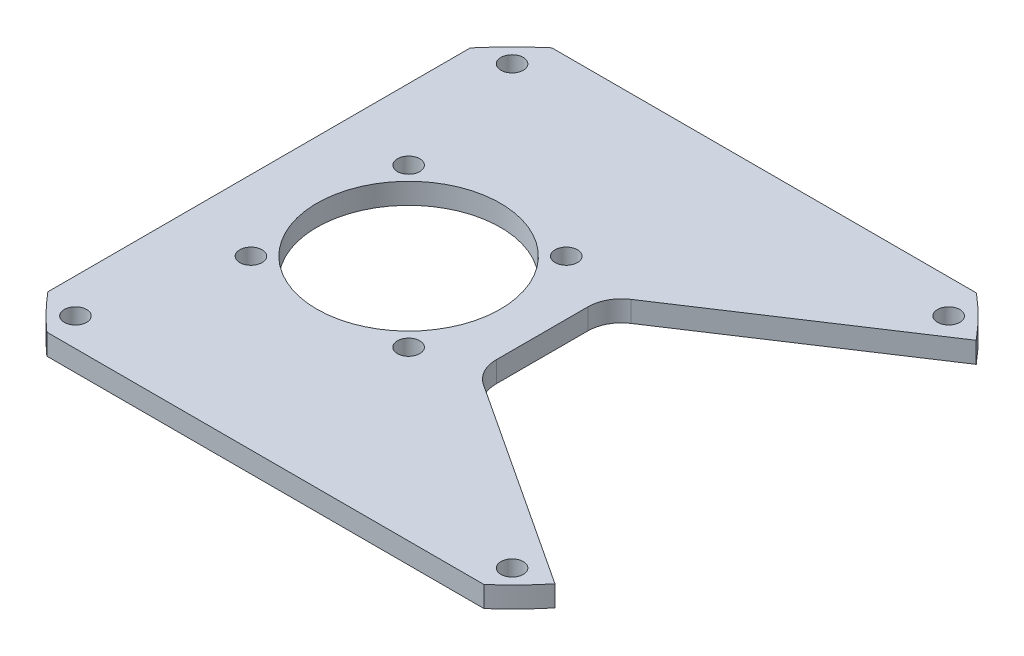
ISO-10303-21;
HEADER;
FILE_DESCRIPTION(('STEP AP214'),'2;1');
FILE_NAME('part.step','',(''),(''),'','','');
FILE_SCHEMA(('AUTOMOTIVE_DESIGN { 1 0 10303 214 1 1 1 1 }'));
ENDSEC;
DATA;
#1=APPLICATION_CONTEXT('core data for automotive mechanical design processes');
#2=APPLICATION_PROTOCOL_DEFINITION('international standard','automotive_design',2000,#1);
#3=PRODUCT_CONTEXT('',#1,'mechanical');
#4=PRODUCT('Part','Part','',(#3));
#5=PRODUCT_RELATED_PRODUCT_CATEGORY('part','',(#4));
#6=PRODUCT_DEFINITION_FORMATION('','',#4);
#7=PRODUCT_DEFINITION_CONTEXT('part definition',#1,'design');
#8=PRODUCT_DEFINITION('design','',#6,#7);
#9=PRODUCT_DEFINITION_SHAPE('','',#8);
#10=(LENGTH_UNIT() NAMED_UNIT(*) SI_UNIT(.MILLI.,.METRE.));
#11=(NAMED_UNIT(*) PLANE_ANGLE_UNIT() SI_UNIT($,.RADIAN.));
#12=(NAMED_UNIT(*) SI_UNIT($,.STERADIAN.) SOLID_ANGLE_UNIT());
#13=UNCERTAINTY_MEASURE_WITH_UNIT(LENGTH_MEASURE(1.E-05),#10,'distance_accuracy_value','');
#14=(GEOMETRIC_REPRESENTATION_CONTEXT(3) GLOBAL_UNCERTAINTY_ASSIGNED_CONTEXT((#13)) GLOBAL_UNIT_ASSIGNED_CONTEXT((#10,
#11,#12)) REPRESENTATION_CONTEXT('',''));
#15=CARTESIAN_POINT('',(0.,0.,0.));
#16=DIRECTION('',(0.,0.,1.));
#17=DIRECTION('',(1.,0.,0.));
#18=AXIS2_PLACEMENT_3D('',#15,#16,#17);
#19=CARTESIAN_POINT('',(0.,1.5875,0.));
#20=DIRECTION('',(0.,1.,0.));
#21=DIRECTION('',(0.,0.,1.));
#22=AXIS2_PLACEMENT_3D('',#19,#20,#21);
#23=PLANE('',#22);
#24=CARTESIAN_POINT('',(-27.748,1.5875,-12.));
#25=DIRECTION('',(0.,1.,0.));
#26=DIRECTION('',(0.,0.,1.));
#27=AXIS2_PLACEMENT_3D('',#24,#25,#26);
#28=CIRCLE('',#27,1.69999999999999);
#29=CARTESIAN_POINT('',(-27.748,1.5875,-10.3));
#30=VERTEX_POINT('',#29);
#31=EDGE_CURVE('E296',#30,#30,#28,.T.);
#32=ORIENTED_EDGE('',*,*,#31,.F.);
#33=EDGE_LOOP('',(#32));
#34=FACE_BOUND('',#33,.T.);
#35=CARTESIAN_POINT('',(-3.748,1.5875,-12.));
#36=DIRECTION('',(0.,1.,0.));
#37=DIRECTION('',(0.,0.,1.));
#38=AXIS2_PLACEMENT_3D('',#35,#36,#37);
#39=CIRCLE('',#38,1.69999999999999);
#40=CARTESIAN_POINT('',(-3.748,1.5875,-10.3));
#41=VERTEX_POINT('',#40);
#42=EDGE_CURVE('E290',#41,#41,#39,.T.);
#43=ORIENTED_EDGE('',*,*,#42,.F.);
#44=EDGE_LOOP('',(#43));
#45=FACE_BOUND('',#44,.T.);
#46=CARTESIAN_POINT('',(-3.74799999999999,1.5875,12.));
#47=DIRECTION('',(0.,1.,0.));
#48=DIRECTION('',(0.,0.,1.));
#49=AXIS2_PLACEMENT_3D('',#46,#47,#48);
#50=CIRCLE('',#49,1.69999999999999);
#51=CARTESIAN_POINT('',(-3.74799999999999,1.5875,13.7));
#52=VERTEX_POINT('',#51);
#53=EDGE_CURVE('E284',#52,#52,#50,.T.);
#54=ORIENTED_EDGE('',*,*,#53,.F.);
#55=EDGE_LOOP('',(#54));
#56=FACE_BOUND('',#55,.T.);
#57=CARTESIAN_POINT('',(-27.748,1.5875,12.));
#58=DIRECTION('',(0.,1.,0.));
#59=DIRECTION('',(0.,0.,1.));
#60=AXIS2_PLACEMENT_3D('',#57,#58,#59);
#61=CIRCLE('',#60,1.69999999999999);
#62=CARTESIAN_POINT('',(-27.748,1.5875,13.7));
#63=VERTEX_POINT('',#62);
#64=EDGE_CURVE('E278',#63,#63,#61,.T.);
#65=ORIENTED_EDGE('',*,*,#64,.F.);
#66=EDGE_LOOP('',(#65));
#67=FACE_BOUND('',#66,.T.);
#68=CARTESIAN_POINT('',(-33.2269476479559,1.5875,-33.2269476479559));
#69=DIRECTION('',(0.,1.,0.));
#70=DIRECTION('',(0.,0.,1.));
#71=AXIS2_PLACEMENT_3D('',#68,#69,#70);
#72=CIRCLE('',#71,1.7);
#73=CARTESIAN_POINT('',(-33.2269476479559,1.5875,-31.5269476479559));
#74=VERTEX_POINT('',#73);
#75=EDGE_CURVE('E272',#74,#74,#72,.T.);
#76=ORIENTED_EDGE('',*,*,#75,.F.);
#77=EDGE_LOOP('',(#76));
#78=FACE_BOUND('',#77,.T.);
#79=CARTESIAN_POINT('',(33.2269476479559,1.5875,-33.2269476479559));
#80=DIRECTION('',(0.,1.,0.));
#81=DIRECTION('',(0.,0.,1.));
#82=AXIS2_PLACEMENT_3D('',#79,#80,#81);
#83=CIRCLE('',#82,1.7);
#84=CARTESIAN_POINT('',(33.2269476479559,1.5875,-31.5269476479559));
#85=VERTEX_POINT('',#84);
#86=EDGE_CURVE('E266',#85,#85,#83,.T.);
#87=ORIENTED_EDGE('',*,*,#86,.F.);
#88=EDGE_LOOP('',(#87));
#89=FACE_BOUND('',#88,.T.);
#90=CARTESIAN_POINT('',(33.2269476479559,1.5875,33.2269476479559));
#91=DIRECTION('',(0.,1.,0.));
#92=DIRECTION('',(0.,0.,1.));
#93=AXIS2_PLACEMENT_3D('',#90,#91,#92);
#94=CIRCLE('',#93,1.7);
#95=CARTESIAN_POINT('',(33.2269476479559,1.5875,34.9269476479559));
#96=VERTEX_POINT('',#95);
#97=EDGE_CURVE('E260',#96,#96,#94,.T.);
#98=ORIENTED_EDGE('',*,*,#97,.F.);
#99=EDGE_LOOP('',(#98));
#100=FACE_BOUND('',#99,.T.);
#101=CARTESIAN_POINT('',(-33.2269476479559,1.5875,33.2269476479559));
#102=DIRECTION('',(0.,1.,0.));
#103=DIRECTION('',(0.,0.,1.));
#104=AXIS2_PLACEMENT_3D('',#101,#102,#103);
#105=CIRCLE('',#104,1.7);
#106=CARTESIAN_POINT('',(-33.2269476479559,1.5875,34.9269476479559));
#107=VERTEX_POINT('',#106);
#108=EDGE_CURVE('E254',#107,#107,#105,.T.);
#109=ORIENTED_EDGE('',*,*,#108,.F.);
#110=EDGE_LOOP('',(#109));
#111=FACE_BOUND('',#110,.T.);
#112=CARTESIAN_POINT('',(0.,1.5875,0.));
#113=DIRECTION('',(0.,1.,0.));
#114=DIRECTION('',(0.,0.,1.));
#115=AXIS2_PLACEMENT_3D('',#112,#113,#114);
#116=CIRCLE('',#115,50.165);
#117=CARTESIAN_POINT('',(-32.3185974565736,1.5875,-38.3671146092582));
#118=VERTEX_POINT('',#117);
#119=CARTESIAN_POINT('',(-38.5094748897854,1.5875,-32.1488346400455));
#120=VERTEX_POINT('',#119);
#121=EDGE_CURVE('E137',#118,#120,#116,.T.);
#122=ORIENTED_EDGE('',*,*,#121,.T.);
#123=DIRECTION('',(0.,0.,1.));
#124=VECTOR('',#123,1.);
#125=CARTESIAN_POINT('',(-38.5094748897854,1.5875,-32.1488346400455));
#126=LINE('',#125,#124);
#127=CARTESIAN_POINT('',(-38.5094748897854,1.5875,32.1488346400455));
#128=VERTEX_POINT('',#127);
#129=EDGE_CURVE('E126',#120,#128,#126,.T.);
#130=ORIENTED_EDGE('',*,*,#129,.T.);
#131=CARTESIAN_POINT('',(0.,1.5875,0.));
#132=DIRECTION('',(0.,1.,0.));
#133=DIRECTION('',(0.,0.,-1.));
#134=AXIS2_PLACEMENT_3D('',#131,#132,#133);
#135=CIRCLE('',#134,50.165);
#136=CARTESIAN_POINT('',(-33.274,1.5875,37.5415522987529));
#137=VERTEX_POINT('',#136);
#138=EDGE_CURVE('E136',#128,#137,#135,.T.);
#139=ORIENTED_EDGE('',*,*,#138,.T.);
#140=DIRECTION('',(1.,0.,0.));
#141=VECTOR('',#140,1.);
#142=CARTESIAN_POINT('',(-33.274,1.5875,37.5415522987529));
#143=LINE('',#142,#141);
#144=CARTESIAN_POINT('',(33.274,1.5875,37.5415522987529));
#145=VERTEX_POINT('',#144);
#146=EDGE_CURVE('E225',#137,#145,#143,.T.);
#147=ORIENTED_EDGE('',*,*,#146,.T.);
#148=CARTESIAN_POINT('',(0.,1.5875,0.));
#149=DIRECTION('',(0.,1.,0.));
#150=DIRECTION('',(0.,0.,-1.));
#151=AXIS2_PLACEMENT_3D('',#148,#149,#150);
#152=CIRCLE('',#151,50.165);
#153=CARTESIAN_POINT('',(38.5872719681109,1.5875,32.0554155652215));
#154=VERTEX_POINT('',#153);
#155=EDGE_CURVE('E242',#145,#154,#152,.T.);
#156=ORIENTED_EDGE('',*,*,#155,.T.);
#157=DIRECTION('',(-0.835913655809009,0.,-0.548860966030577));
#158=VECTOR('',#157,1.);
#159=CARTESIAN_POINT('',(4.572,1.5875,9.72098556462359));
#160=LINE('',#159,#158);
#161=CARTESIAN_POINT('',(6.86378629256467,1.5875,11.2257726077965));
#162=VERTEX_POINT('',#161);
#163=EDGE_CURVE('E240',#154,#162,#160,.T.);
#164=ORIENTED_EDGE('',*,*,#163,.T.);
#165=CARTESIAN_POINT('',(9.652,1.5875,6.97933123628671));
#166=DIRECTION('',(0.,1.,0.));
#167=DIRECTION('',(0.,0.,1.));
#168=AXIS2_PLACEMENT_3D('',#165,#166,#167);
#169=CIRCLE('',#168,5.08);
#170=CARTESIAN_POINT('',(4.572,1.5875,6.97933123628671));
#171=VERTEX_POINT('',#170);
#172=EDGE_CURVE('E11',#162,#171,#169,.F.);
#173=ORIENTED_EDGE('',*,*,#172,.T.);
#174=DIRECTION('',(0.,0.,-1.));
#175=VECTOR('',#174,1.);
#176=CARTESIAN_POINT('',(4.572,1.5875,-9.72098556462359));
#177=LINE('',#176,#175);
#178=CARTESIAN_POINT('',(4.572,1.5875,-6.98507778431384));
#179=VERTEX_POINT('',#178);
#180=EDGE_CURVE('E174',#171,#179,#177,.T.);
#181=ORIENTED_EDGE('',*,*,#180,.T.);
#182=CARTESIAN_POINT('',(9.652,1.5875,-6.98507778431384));
#183=DIRECTION('',(0.,1.,0.));
#184=DIRECTION('',(0.,0.,1.));
#185=AXIS2_PLACEMENT_3D('',#182,#183,#184);
#186=CIRCLE('',#185,5.08);
#187=CARTESIAN_POINT('',(6.85634692626526,1.5875,-11.2266251306625));
#188=VERTEX_POINT('',#187);
#189=EDGE_CURVE('E167',#179,#188,#186,.F.);
#190=ORIENTED_EDGE('',*,*,#189,.T.);
#191=DIRECTION('',(0.834950265029267,0.,-0.5503254082155));
#192=VECTOR('',#191,1.);
#193=CARTESIAN_POINT('',(4.572,1.5875,-9.72098556462359));
#194=LINE('',#193,#192);
#195=CARTESIAN_POINT('',(38.5413694712102,1.5875,-32.1105911543788));
#196=VERTEX_POINT('',#195);
#197=EDGE_CURVE('E171',#188,#196,#194,.T.);
#198=ORIENTED_EDGE('',*,*,#197,.T.);
#199=CARTESIAN_POINT('',(0.,1.5875,0.));
#200=DIRECTION('',(0.,1.,0.));
#201=DIRECTION('',(0.,0.,1.));
#202=AXIS2_PLACEMENT_3D('',#199,#200,#201);
#203=CIRCLE('',#202,50.165);
#204=CARTESIAN_POINT('',(32.3185974565736,1.5875,-38.3671146092582));
#205=VERTEX_POINT('',#204);
#206=EDGE_CURVE('E184',#196,#205,#203,.T.);
#207=ORIENTED_EDGE('',*,*,#206,.T.);
#208=DIRECTION('',(-1.,0.,0.));
#209=VECTOR('',#208,1.);
#210=CARTESIAN_POINT('',(-32.3185974565736,1.5875,-38.3671146092582));
#211=LINE('',#210,#209);
#212=EDGE_CURVE('E142',#205,#118,#211,.T.);
#213=ORIENTED_EDGE('',*,*,#212,.T.);
#214=EDGE_LOOP('',(#122,#130,#139,#147,#156,#164,#173,#181,#190,#198,#207,#213));
#215=FACE_BOUND('',#214,.T.);
#216=CARTESIAN_POINT('',(-15.748,1.5875,0.));
#217=DIRECTION('',(0.,1.,0.));
#218=DIRECTION('',(0.,0.,1.));
#219=AXIS2_PLACEMENT_3D('',#216,#217,#218);
#220=CIRCLE('',#219,13.97);
#221=CARTESIAN_POINT('',(-15.748,1.5875,13.97));
#222=VERTEX_POINT('',#221);
#223=EDGE_CURVE('E236',#222,#222,#220,.T.);
#224=ORIENTED_EDGE('',*,*,#223,.F.);
#225=EDGE_LOOP('',(#224));
#226=FACE_BOUND('',#225,.T.);
#227=ADVANCED_FACE('F37',(#34,#45,#56,#67,#78,#89,#100,#111,#215,#226),#23,.T.);
#228=CARTESIAN_POINT('',(0.,-1.5875,0.));
#229=DIRECTION('',(0.,1.,0.));
#230=DIRECTION('',(0.,0.,1.));
#231=AXIS2_PLACEMENT_3D('',#228,#229,#230);
#232=PLANE('',#231);
#233=CARTESIAN_POINT('',(-27.748,-1.5875,-12.));
#234=DIRECTION('',(0.,1.,0.));
#235=DIRECTION('',(0.,0.,1.));
#236=AXIS2_PLACEMENT_3D('',#233,#234,#235);
#237=CIRCLE('',#236,1.7);
#238=CARTESIAN_POINT('',(-27.748,-1.5875,-10.3));
#239=VERTEX_POINT('',#238);
#240=EDGE_CURVE('E293',#239,#239,#237,.T.);
#241=ORIENTED_EDGE('',*,*,#240,.T.);
#242=EDGE_LOOP('',(#241));
#243=FACE_BOUND('',#242,.T.);
#244=CARTESIAN_POINT('',(-3.748,-1.5875,-12.));
#245=DIRECTION('',(0.,1.,0.));
#246=DIRECTION('',(0.,0.,1.));
#247=AXIS2_PLACEMENT_3D('',#244,#245,#246);
#248=CIRCLE('',#247,1.7);
#249=CARTESIAN_POINT('',(-3.748,-1.5875,-10.3));
#250=VERTEX_POINT('',#249);
#251=EDGE_CURVE('E287',#250,#250,#248,.T.);
#252=ORIENTED_EDGE('',*,*,#251,.T.);
#253=EDGE_LOOP('',(#252));
#254=FACE_BOUND('',#253,.T.);
#255=CARTESIAN_POINT('',(-3.74799999999999,-1.5875,12.));
#256=DIRECTION('',(0.,1.,0.));
#257=DIRECTION('',(0.,0.,1.));
#258=AXIS2_PLACEMENT_3D('',#255,#256,#257);
#259=CIRCLE('',#258,1.7);
#260=CARTESIAN_POINT('',(-3.74799999999999,-1.5875,13.7));
#261=VERTEX_POINT('',#260);
#262=EDGE_CURVE('E281',#261,#261,#259,.T.);
#263=ORIENTED_EDGE('',*,*,#262,.T.);
#264=EDGE_LOOP('',(#263));
#265=FACE_BOUND('',#264,.T.);
#266=CARTESIAN_POINT('',(-27.748,-1.5875,12.));
#267=DIRECTION('',(0.,1.,0.));
#268=DIRECTION('',(0.,0.,1.));
#269=AXIS2_PLACEMENT_3D('',#266,#267,#268);
#270=CIRCLE('',#269,1.7);
#271=CARTESIAN_POINT('',(-27.748,-1.5875,13.7));
#272=VERTEX_POINT('',#271);
#273=EDGE_CURVE('E275',#272,#272,#270,.T.);
#274=ORIENTED_EDGE('',*,*,#273,.T.);
#275=EDGE_LOOP('',(#274));
#276=FACE_BOUND('',#275,.T.);
#277=CARTESIAN_POINT('',(-33.2269476479559,-1.5875,-33.2269476479559));
#278=DIRECTION('',(0.,1.,0.));
#279=DIRECTION('',(0.,0.,1.));
#280=AXIS2_PLACEMENT_3D('',#277,#278,#279);
#281=CIRCLE('',#280,1.7);
#282=CARTESIAN_POINT('',(-33.2269476479559,-1.5875,-31.5269476479559));
#283=VERTEX_POINT('',#282);
#284=EDGE_CURVE('E269',#283,#283,#281,.T.);
#285=ORIENTED_EDGE('',*,*,#284,.T.);
#286=EDGE_LOOP('',(#285));
#287=FACE_BOUND('',#286,.T.);
#288=CARTESIAN_POINT('',(33.2269476479559,-1.5875,-33.2269476479559));
#289=DIRECTION('',(0.,1.,0.));
#290=DIRECTION('',(0.,0.,1.));
#291=AXIS2_PLACEMENT_3D('',#288,#289,#290);
#292=CIRCLE('',#291,1.7);
#293=CARTESIAN_POINT('',(33.2269476479559,-1.5875,-31.5269476479559));
#294=VERTEX_POINT('',#293);
#295=EDGE_CURVE('E263',#294,#294,#292,.T.);
#296=ORIENTED_EDGE('',*,*,#295,.T.);
#297=EDGE_LOOP('',(#296));
#298=FACE_BOUND('',#297,.T.);
#299=CARTESIAN_POINT('',(33.2269476479559,-1.5875,33.2269476479559));
#300=DIRECTION('',(0.,1.,0.));
#301=DIRECTION('',(0.,0.,1.));
#302=AXIS2_PLACEMENT_3D('',#299,#300,#301);
#303=CIRCLE('',#302,1.7);
#304=CARTESIAN_POINT('',(33.2269476479559,-1.5875,34.9269476479559));
#305=VERTEX_POINT('',#304);
#306=EDGE_CURVE('E257',#305,#305,#303,.T.);
#307=ORIENTED_EDGE('',*,*,#306,.T.);
#308=EDGE_LOOP('',(#307));
#309=FACE_BOUND('',#308,.T.);
#310=CARTESIAN_POINT('',(-33.2269476479559,-1.5875,33.2269476479559));
#311=DIRECTION('',(0.,1.,0.));
#312=DIRECTION('',(0.,0.,1.));
#313=AXIS2_PLACEMENT_3D('',#310,#311,#312);
#314=CIRCLE('',#313,1.7);
#315=CARTESIAN_POINT('',(-33.2269476479559,-1.5875,34.9269476479559));
#316=VERTEX_POINT('',#315);
#317=EDGE_CURVE('E249',#316,#316,#314,.T.);
#318=ORIENTED_EDGE('',*,*,#317,.T.);
#319=EDGE_LOOP('',(#318));
#320=FACE_BOUND('',#319,.T.);
#321=CARTESIAN_POINT('',(0.,-1.5875,0.));
#322=DIRECTION('',(0.,1.,0.));
#323=DIRECTION('',(0.,0.,1.));
#324=AXIS2_PLACEMENT_3D('',#321,#322,#323);
#325=CIRCLE('',#324,50.165);
#326=CARTESIAN_POINT('',(-32.3185974565736,-1.5875,-38.3671146092582));
#327=VERTEX_POINT('',#326);
#328=CARTESIAN_POINT('',(-38.5094748897854,-1.5875,-32.1488346400455));
#329=VERTEX_POINT('',#328);
#330=EDGE_CURVE('E150',#327,#329,#325,.T.);
#331=ORIENTED_EDGE('',*,*,#330,.F.);
#332=DIRECTION('',(-1.,0.,0.));
#333=VECTOR('',#332,1.);
#334=CARTESIAN_POINT('',(-32.3185974565736,-1.5875,-38.3671146092582));
#335=LINE('',#334,#333);
#336=CARTESIAN_POINT('',(32.3185974565736,-1.5875,-38.3671146092582));
#337=VERTEX_POINT('',#336);
#338=EDGE_CURVE('E146',#337,#327,#335,.T.);
#339=ORIENTED_EDGE('',*,*,#338,.F.);
#340=CARTESIAN_POINT('',(0.,-1.5875,0.));
#341=DIRECTION('',(0.,1.,0.));
#342=DIRECTION('',(0.,0.,1.));
#343=AXIS2_PLACEMENT_3D('',#340,#341,#342);
#344=CIRCLE('',#343,50.165);
#345=CARTESIAN_POINT('',(38.5413694712102,-1.5875,-32.1105911543788));
#346=VERTEX_POINT('',#345);
#347=EDGE_CURVE('E198',#346,#337,#344,.T.);
#348=ORIENTED_EDGE('',*,*,#347,.F.);
#349=DIRECTION('',(0.834950265029267,0.,-0.5503254082155));
#350=VECTOR('',#349,1.);
#351=CARTESIAN_POINT('',(4.572,-1.5875,-9.72098556462359));
#352=LINE('',#351,#350);
#353=CARTESIAN_POINT('',(6.85634692626526,-1.5875,-11.2266251306625));
#354=VERTEX_POINT('',#353);
#355=EDGE_CURVE('E192',#354,#346,#352,.T.);
#356=ORIENTED_EDGE('',*,*,#355,.F.);
#357=CARTESIAN_POINT('',(9.652,-1.5875,-6.98507778431384));
#358=DIRECTION('',(0.,1.,0.));
#359=DIRECTION('',(0.,0.,1.));
#360=AXIS2_PLACEMENT_3D('',#357,#358,#359);
#361=CIRCLE('',#360,5.08);
#362=CARTESIAN_POINT('',(4.572,-1.5875,-6.98507778431384));
#363=VERTEX_POINT('',#362);
#364=EDGE_CURVE('E165',#354,#363,#361,.T.);
#365=ORIENTED_EDGE('',*,*,#364,.T.);
#366=DIRECTION('',(0.,0.,-1.));
#367=VECTOR('',#366,1.);
#368=CARTESIAN_POINT('',(4.572,-1.5875,-9.72098556462359));
#369=LINE('',#368,#367);
#370=CARTESIAN_POINT('',(4.572,-1.5875,6.97933123628671));
#371=VERTEX_POINT('',#370);
#372=EDGE_CURVE('E190',#371,#363,#369,.T.);
#373=ORIENTED_EDGE('',*,*,#372,.F.);
#374=CARTESIAN_POINT('',(9.652,-1.5875,6.97933123628671));
#375=DIRECTION('',(0.,1.,0.));
#376=DIRECTION('',(0.,0.,1.));
#377=AXIS2_PLACEMENT_3D('',#374,#375,#376);
#378=CIRCLE('',#377,5.08);
#379=CARTESIAN_POINT('',(6.86378629256467,-1.5875,11.2257726077965));
#380=VERTEX_POINT('',#379);
#381=EDGE_CURVE('E45',#371,#380,#378,.T.);
#382=ORIENTED_EDGE('',*,*,#381,.T.);
#383=DIRECTION('',(-0.835913655809009,0.,-0.548860966030577));
#384=VECTOR('',#383,1.);
#385=CARTESIAN_POINT('',(4.572,-1.5875,9.72098556462359));
#386=LINE('',#385,#384);
#387=CARTESIAN_POINT('',(38.5872719681109,-1.5875,32.0554155652215));
#388=VERTEX_POINT('',#387);
#389=EDGE_CURVE('E196',#388,#380,#386,.T.);
#390=ORIENTED_EDGE('',*,*,#389,.F.);
#391=CARTESIAN_POINT('',(0.,-1.5875,0.));
#392=DIRECTION('',(0.,1.,0.));
#393=DIRECTION('',(0.,0.,-1.));
#394=AXIS2_PLACEMENT_3D('',#391,#392,#393);
#395=CIRCLE('',#394,50.165);
#396=CARTESIAN_POINT('',(33.274,-1.5875,37.5415522987529));
#397=VERTEX_POINT('',#396);
#398=EDGE_CURVE('E200',#397,#388,#395,.T.);
#399=ORIENTED_EDGE('',*,*,#398,.F.);
#400=DIRECTION('',(1.,0.,0.));
#401=VECTOR('',#400,1.);
#402=CARTESIAN_POINT('',(-33.274,-1.5875,37.5415522987529));
#403=LINE('',#402,#401);
#404=CARTESIAN_POINT('',(-33.274,-1.5875,37.5415522987529));
#405=VERTEX_POINT('',#404);
#406=EDGE_CURVE('E224',#405,#397,#403,.T.);
#407=ORIENTED_EDGE('',*,*,#406,.F.);
#408=CARTESIAN_POINT('',(0.,-1.5875,0.));
#409=DIRECTION('',(0.,1.,0.));
#410=DIRECTION('',(0.,0.,-1.));
#411=AXIS2_PLACEMENT_3D('',#408,#409,#410);
#412=CIRCLE('',#411,50.165);
#413=CARTESIAN_POINT('',(-38.5094748897854,-1.5875,32.1488346400455));
#414=VERTEX_POINT('',#413);
#415=EDGE_CURVE('E229',#414,#405,#412,.T.);
#416=ORIENTED_EDGE('',*,*,#415,.F.);
#417=DIRECTION('',(0.,0.,1.));
#418=VECTOR('',#417,1.);
#419=CARTESIAN_POINT('',(-38.5094748897854,-1.5875,-32.1488346400455));
#420=LINE('',#419,#418);
#421=EDGE_CURVE('E231',#329,#414,#420,.T.);
#422=ORIENTED_EDGE('',*,*,#421,.F.);
#423=EDGE_LOOP('',(#331,#339,#348,#356,#365,#373,#382,#390,#399,#407,#416,#422));
#424=FACE_BOUND('',#423,.T.);
#425=CARTESIAN_POINT('',(-15.748,-1.5875,0.));
#426=DIRECTION('',(0.,1.,0.));
#427=DIRECTION('',(0.,0.,1.));
#428=AXIS2_PLACEMENT_3D('',#425,#426,#427);
#429=CIRCLE('',#428,13.97);
#430=CARTESIAN_POINT('',(-15.748,-1.5875,13.97));
#431=VERTEX_POINT('',#430);
#432=EDGE_CURVE('E246',#431,#431,#429,.T.);
#433=ORIENTED_EDGE('',*,*,#432,.T.);
#434=EDGE_LOOP('',(#433));
#435=FACE_BOUND('',#434,.T.);
#436=ADVANCED_FACE('F188',(#243,#254,#265,#276,#287,#298,#309,#320,#424,#435),#232,.F.);
#437=CARTESIAN_POINT('',(0.,1.5875,0.));
#438=DIRECTION('',(0.,-1.,0.));
#439=DIRECTION('',(0.,0.,-1.));
#440=AXIS2_PLACEMENT_3D('',#437,#438,#439);
#441=CYLINDRICAL_SURFACE('',#440,50.165);
#442=ORIENTED_EDGE('',*,*,#330,.T.);
#443=DIRECTION('',(0.,-1.,0.));
#444=VECTOR('',#443,1.);
#445=CARTESIAN_POINT('',(-38.5094748897854,1.5875,-32.1488346400455));
#446=LINE('',#445,#444);
#447=EDGE_CURVE('E130',#120,#329,#446,.T.);
#448=ORIENTED_EDGE('',*,*,#447,.F.);
#449=ORIENTED_EDGE('',*,*,#121,.F.);
#450=DIRECTION('',(0.,-1.,0.));
#451=VECTOR('',#450,1.);
#452=CARTESIAN_POINT('',(-32.3185974565736,1.5875,-38.3671146092582));
#453=LINE('',#452,#451);
#454=EDGE_CURVE('E206',#118,#327,#453,.T.);
#455=ORIENTED_EDGE('',*,*,#454,.T.);
#456=EDGE_LOOP('',(#442,#448,#449,#455));
#457=FACE_BOUND('',#456,.T.);
#458=ADVANCED_FACE('F148',(#457),#441,.T.);
#459=CARTESIAN_POINT('',(-38.5094748897854,1.5875,-32.1488346400455));
#460=DIRECTION('',(1.,0.,0.));
#461=DIRECTION('',(0.,0.,-1.));
#462=AXIS2_PLACEMENT_3D('',#459,#460,#461);
#463=PLANE('',#462);
#464=ORIENTED_EDGE('',*,*,#421,.T.);
#465=DIRECTION('',(0.,-1.,0.));
#466=VECTOR('',#465,1.);
#467=CARTESIAN_POINT('',(-38.5094748897854,1.5875,32.1488346400455));
#468=LINE('',#467,#466);
#469=EDGE_CURVE('E133',#128,#414,#468,.T.);
#470=ORIENTED_EDGE('',*,*,#469,.F.);
#471=ORIENTED_EDGE('',*,*,#129,.F.);
#472=ORIENTED_EDGE('',*,*,#447,.T.);
#473=EDGE_LOOP('',(#464,#470,#471,#472));
#474=FACE_BOUND('',#473,.T.);
#475=ADVANCED_FACE('F128',(#474),#463,.F.);
#476=CARTESIAN_POINT('',(0.,1.5875,0.));
#477=DIRECTION('',(0.,-1.,0.));
#478=DIRECTION('',(0.,0.,-1.));
#479=AXIS2_PLACEMENT_3D('',#476,#477,#478);
#480=CYLINDRICAL_SURFACE('',#479,50.165);
#481=ORIENTED_EDGE('',*,*,#415,.T.);
#482=DIRECTION('',(0.,-1.,0.));
#483=VECTOR('',#482,1.);
#484=CARTESIAN_POINT('',(-33.274,1.5875,37.5415522987529));
#485=LINE('',#484,#483);
#486=EDGE_CURVE('E156',#137,#405,#485,.T.);
#487=ORIENTED_EDGE('',*,*,#486,.F.);
#488=ORIENTED_EDGE('',*,*,#138,.F.);
#489=ORIENTED_EDGE('',*,*,#469,.T.);
#490=EDGE_LOOP('',(#481,#487,#488,#489));
#491=FACE_BOUND('',#490,.T.);
#492=ADVANCED_FACE('F363',(#491),#480,.T.);
#493=CARTESIAN_POINT('',(-33.274,1.5875,37.5415522987529));
#494=DIRECTION('',(0.,0.,-1.));
#495=DIRECTION('',(-1.,0.,0.));
#496=AXIS2_PLACEMENT_3D('',#493,#494,#495);
#497=PLANE('',#496);
#498=ORIENTED_EDGE('',*,*,#406,.T.);
#499=DIRECTION('',(0.,-1.,0.));
#500=VECTOR('',#499,1.);
#501=CARTESIAN_POINT('',(33.274,1.5875,37.5415522987529));
#502=LINE('',#501,#500);
#503=EDGE_CURVE('E215',#145,#397,#502,.T.);
#504=ORIENTED_EDGE('',*,*,#503,.F.);
#505=ORIENTED_EDGE('',*,*,#146,.F.);
#506=ORIENTED_EDGE('',*,*,#486,.T.);
#507=EDGE_LOOP('',(#498,#504,#505,#506));
#508=FACE_BOUND('',#507,.T.);
#509=ADVANCED_FACE('F222',(#508),#497,.F.);
#510=CARTESIAN_POINT('',(0.,1.5875,0.));
#511=DIRECTION('',(0.,-1.,0.));
#512=DIRECTION('',(0.,0.,-1.));
#513=AXIS2_PLACEMENT_3D('',#510,#511,#512);
#514=CYLINDRICAL_SURFACE('',#513,50.165);
#515=ORIENTED_EDGE('',*,*,#398,.T.);
#516=DIRECTION('',(0.,-1.,0.));
#517=VECTOR('',#516,1.);
#518=CARTESIAN_POINT('',(38.5872719681109,1.5875,32.0554155652215));
#519=LINE('',#518,#517);
#520=EDGE_CURVE('E212',#154,#388,#519,.T.);
#521=ORIENTED_EDGE('',*,*,#520,.F.);
#522=ORIENTED_EDGE('',*,*,#155,.F.);
#523=ORIENTED_EDGE('',*,*,#503,.T.);
#524=EDGE_LOOP('',(#515,#521,#522,#523));
#525=FACE_BOUND('',#524,.T.);
#526=ADVANCED_FACE('F357',(#525),#514,.T.);
#527=CARTESIAN_POINT('',(4.572,1.5875,9.72098556462359));
#528=DIRECTION('',(-0.548860966030577,0.,0.835913655809008));
#529=DIRECTION('',(0.835913655809008,0.,0.548860966030577));
#530=AXIS2_PLACEMENT_3D('',#527,#528,#529);
#531=PLANE('',#530);
#532=ORIENTED_EDGE('',*,*,#389,.T.);
#533=DIRECTION('',(0.,-1.,0.));
#534=VECTOR('',#533,1.);
#535=CARTESIAN_POINT('',(6.86378629256467,1.5875,11.2257726077965));
#536=LINE('',#535,#534);
#537=EDGE_CURVE('E52',#380,#162,#536,.F.);
#538=ORIENTED_EDGE('',*,*,#537,.T.);
#539=ORIENTED_EDGE('',*,*,#163,.F.);
#540=ORIENTED_EDGE('',*,*,#520,.T.);
#541=EDGE_LOOP('',(#532,#538,#539,#540));
#542=FACE_BOUND('',#541,.T.);
#543=ADVANCED_FACE('F354',(#542),#531,.F.);
#544=CARTESIAN_POINT('',(4.572,1.5875,-9.72098556462359));
#545=DIRECTION('',(-1.,0.,0.));
#546=DIRECTION('',(0.,0.,1.));
#547=AXIS2_PLACEMENT_3D('',#544,#545,#546);
#548=PLANE('',#547);
#549=ORIENTED_EDGE('',*,*,#372,.T.);
#550=DIRECTION('',(0.,-1.,0.));
#551=VECTOR('',#550,1.);
#552=CARTESIAN_POINT('',(4.572,1.5875,-6.98507778431384));
#553=LINE('',#552,#551);
#554=EDGE_CURVE('E162',#363,#179,#553,.F.);
#555=ORIENTED_EDGE('',*,*,#554,.T.);
#556=ORIENTED_EDGE('',*,*,#180,.F.);
#557=DIRECTION('',(0.,-1.,0.));
#558=VECTOR('',#557,1.);
#559=CARTESIAN_POINT('',(4.572,-1.5875,6.97933123628671));
#560=LINE('',#559,#558);
#561=EDGE_CURVE('E154',#171,#371,#560,.T.);
#562=ORIENTED_EDGE('',*,*,#561,.T.);
#563=EDGE_LOOP('',(#549,#555,#556,#562));
#564=FACE_BOUND('',#563,.T.);
#565=ADVANCED_FACE('F194',(#564),#548,.F.);
#566=CARTESIAN_POINT('',(4.572,1.5875,-9.72098556462359));
#567=DIRECTION('',(-0.5503254082155,0.,-0.834950265029267));
#568=DIRECTION('',(-0.834950265029267,0.,0.5503254082155));
#569=AXIS2_PLACEMENT_3D('',#566,#567,#568);
#570=PLANE('',#569);
#571=ORIENTED_EDGE('',*,*,#197,.F.);
#572=DIRECTION('',(0.,-1.,0.));
#573=VECTOR('',#572,1.);
#574=CARTESIAN_POINT('',(6.85634692626526,-1.5875,-11.2266251306625));
#575=LINE('',#574,#573);
#576=EDGE_CURVE('E151',#188,#354,#575,.T.);
#577=ORIENTED_EDGE('',*,*,#576,.T.);
#578=ORIENTED_EDGE('',*,*,#355,.T.);
#579=DIRECTION('',(0.,-1.,0.));
#580=VECTOR('',#579,1.);
#581=CARTESIAN_POINT('',(38.5413694712102,1.5875,-32.1105911543788));
#582=LINE('',#581,#580);
#583=EDGE_CURVE('E182',#196,#346,#582,.T.);
#584=ORIENTED_EDGE('',*,*,#583,.F.);
#585=EDGE_LOOP('',(#571,#577,#578,#584));
#586=FACE_BOUND('',#585,.T.);
#587=ADVANCED_FACE('F179',(#586),#570,.F.);
#588=CARTESIAN_POINT('',(0.,1.5875,0.));
#589=DIRECTION('',(0.,-1.,0.));
#590=DIRECTION('',(0.,0.,-1.));
#591=AXIS2_PLACEMENT_3D('',#588,#589,#590);
#592=CYLINDRICAL_SURFACE('',#591,50.165);
#593=ORIENTED_EDGE('',*,*,#347,.T.);
#594=DIRECTION('',(0.,-1.,0.));
#595=VECTOR('',#594,1.);
#596=CARTESIAN_POINT('',(32.3185974565736,1.5875,-38.3671146092582));
#597=LINE('',#596,#595);
#598=EDGE_CURVE('E208',#205,#337,#597,.T.);
#599=ORIENTED_EDGE('',*,*,#598,.F.);
#600=ORIENTED_EDGE('',*,*,#206,.F.);
#601=ORIENTED_EDGE('',*,*,#583,.T.);
#602=EDGE_LOOP('',(#593,#599,#600,#601));
#603=FACE_BOUND('',#602,.T.);
#604=ADVANCED_FACE('F345',(#603),#592,.T.);
#605=CARTESIAN_POINT('',(-32.3185974565736,1.5875,-38.3671146092582));
#606=DIRECTION('',(0.,0.,1.));
#607=DIRECTION('',(1.,0.,0.));
#608=AXIS2_PLACEMENT_3D('',#605,#606,#607);
#609=PLANE('',#608);
#610=ORIENTED_EDGE('',*,*,#338,.T.);
#611=ORIENTED_EDGE('',*,*,#454,.F.);
#612=ORIENTED_EDGE('',*,*,#212,.F.);
#613=ORIENTED_EDGE('',*,*,#598,.T.);
#614=EDGE_LOOP('',(#610,#611,#612,#613));
#615=FACE_BOUND('',#614,.T.);
#616=ADVANCED_FACE('F337',(#615),#609,.F.);
#617=CARTESIAN_POINT('',(-15.748,1.5875,0.));
#618=DIRECTION('',(0.,-1.,0.));
#619=DIRECTION('',(0.,0.,-1.));
#620=AXIS2_PLACEMENT_3D('',#617,#618,#619);
#621=CYLINDRICAL_SURFACE('',#620,13.97);
#622=ORIENTED_EDGE('',*,*,#223,.T.);
#623=EDGE_LOOP('',(#622));
#624=FACE_BOUND('',#623,.T.);
#625=ORIENTED_EDGE('',*,*,#432,.F.);
#626=EDGE_LOOP('',(#625));
#627=FACE_BOUND('',#626,.T.);
#628=ADVANCED_FACE('F335',(#624,#627),#621,.F.);
#629=CARTESIAN_POINT('',(9.652,1.5875,-6.98507778431384));
#630=DIRECTION('',(0.,1.,0.));
#631=DIRECTION('',(0.,0.,1.));
#632=AXIS2_PLACEMENT_3D('',#629,#630,#631);
#633=CYLINDRICAL_SURFACE('',#632,5.08);
#634=ORIENTED_EDGE('',*,*,#189,.F.);
#635=ORIENTED_EDGE('',*,*,#554,.F.);
#636=ORIENTED_EDGE('',*,*,#364,.F.);
#637=ORIENTED_EDGE('',*,*,#576,.F.);
#638=EDGE_LOOP('',(#634,#635,#636,#637));
#639=FACE_BOUND('',#638,.T.);
#640=ADVANCED_FACE('F186',(#639),#633,.F.);
#641=CARTESIAN_POINT('',(9.652,1.5875,6.97933123628671));
#642=DIRECTION('',(0.,1.,0.));
#643=DIRECTION('',(0.,0.,1.));
#644=AXIS2_PLACEMENT_3D('',#641,#642,#643);
#645=CYLINDRICAL_SURFACE('',#644,5.08);
#646=ORIENTED_EDGE('',*,*,#172,.F.);
#647=ORIENTED_EDGE('',*,*,#537,.F.);
#648=ORIENTED_EDGE('',*,*,#381,.F.);
#649=ORIENTED_EDGE('',*,*,#561,.F.);
#650=EDGE_LOOP('',(#646,#647,#648,#649));
#651=FACE_BOUND('',#650,.T.);
#652=ADVANCED_FACE('F39',(#651),#645,.F.);
#653=CARTESIAN_POINT('',(-33.2269476479559,1.5875,33.2269476479559));
#654=DIRECTION('',(0.,1.,0.));
#655=DIRECTION('',(0.,0.,1.));
#656=AXIS2_PLACEMENT_3D('',#653,#654,#655);
#657=CYLINDRICAL_SURFACE('',#656,1.7);
#658=ORIENTED_EDGE('',*,*,#317,.F.);
#659=EDGE_LOOP('',(#658));
#660=FACE_BOUND('',#659,.T.);
#661=ORIENTED_EDGE('',*,*,#108,.T.);
#662=EDGE_LOOP('',(#661));
#663=FACE_BOUND('',#662,.T.);
#664=ADVANCED_FACE('F319',(#660,#663),#657,.F.);
#665=CARTESIAN_POINT('',(33.2269476479559,1.5875,33.2269476479559));
#666=DIRECTION('',(0.,1.,0.));
#667=DIRECTION('',(0.,0.,1.));
#668=AXIS2_PLACEMENT_3D('',#665,#666,#667);
#669=CYLINDRICAL_SURFACE('',#668,1.7);
#670=ORIENTED_EDGE('',*,*,#306,.F.);
#671=EDGE_LOOP('',(#670));
#672=FACE_BOUND('',#671,.T.);
#673=ORIENTED_EDGE('',*,*,#97,.T.);
#674=EDGE_LOOP('',(#673));
#675=FACE_BOUND('',#674,.T.);
#676=ADVANCED_FACE('F321',(#672,#675),#669,.F.);
#677=CARTESIAN_POINT('',(33.2269476479559,1.5875,-33.2269476479559));
#678=DIRECTION('',(0.,1.,0.));
#679=DIRECTION('',(0.,0.,1.));
#680=AXIS2_PLACEMENT_3D('',#677,#678,#679);
#681=CYLINDRICAL_SURFACE('',#680,1.7);
#682=ORIENTED_EDGE('',*,*,#295,.F.);
#683=EDGE_LOOP('',(#682));
#684=FACE_BOUND('',#683,.T.);
#685=ORIENTED_EDGE('',*,*,#86,.T.);
#686=EDGE_LOOP('',(#685));
#687=FACE_BOUND('',#686,.T.);
#688=ADVANCED_FACE('F328',(#684,#687),#681,.F.);
#689=CARTESIAN_POINT('',(-33.2269476479559,1.5875,-33.2269476479559));
#690=DIRECTION('',(0.,1.,0.));
#691=DIRECTION('',(0.,0.,1.));
#692=AXIS2_PLACEMENT_3D('',#689,#690,#691);
#693=CYLINDRICAL_SURFACE('',#692,1.7);
#694=ORIENTED_EDGE('',*,*,#284,.F.);
#695=EDGE_LOOP('',(#694));
#696=FACE_BOUND('',#695,.T.);
#697=ORIENTED_EDGE('',*,*,#75,.T.);
#698=EDGE_LOOP('',(#697));
#699=FACE_BOUND('',#698,.T.);
#700=ADVANCED_FACE('F398',(#696,#699),#693,.F.);
#701=CARTESIAN_POINT('',(-27.748,1.5875,12.));
#702=DIRECTION('',(0.,1.,0.));
#703=DIRECTION('',(0.,0.,1.));
#704=AXIS2_PLACEMENT_3D('',#701,#702,#703);
#705=CYLINDRICAL_SURFACE('',#704,1.69999999999999);
#706=ORIENTED_EDGE('',*,*,#273,.F.);
#707=EDGE_LOOP('',(#706));
#708=FACE_BOUND('',#707,.T.);
#709=ORIENTED_EDGE('',*,*,#64,.T.);
#710=EDGE_LOOP('',(#709));
#711=FACE_BOUND('',#710,.T.);
#712=ADVANCED_FACE('F407',(#708,#711),#705,.F.);
#713=CARTESIAN_POINT('',(-3.74799999999999,1.5875,12.));
#714=DIRECTION('',(0.,1.,0.));
#715=DIRECTION('',(0.,0.,1.));
#716=AXIS2_PLACEMENT_3D('',#713,#714,#715);
#717=CYLINDRICAL_SURFACE('',#716,1.69999999999999);
#718=ORIENTED_EDGE('',*,*,#262,.F.);
#719=EDGE_LOOP('',(#718));
#720=FACE_BOUND('',#719,.T.);
#721=ORIENTED_EDGE('',*,*,#53,.T.);
#722=EDGE_LOOP('',(#721));
#723=FACE_BOUND('',#722,.T.);
#724=ADVANCED_FACE('F430',(#720,#723),#717,.F.);
#725=CARTESIAN_POINT('',(-3.748,1.5875,-12.));
#726=DIRECTION('',(0.,1.,0.));
#727=DIRECTION('',(0.,0.,1.));
#728=AXIS2_PLACEMENT_3D('',#725,#726,#727);
#729=CYLINDRICAL_SURFACE('',#728,1.69999999999999);
#730=ORIENTED_EDGE('',*,*,#251,.F.);
#731=EDGE_LOOP('',(#730));
#732=FACE_BOUND('',#731,.T.);
#733=ORIENTED_EDGE('',*,*,#42,.T.);
#734=EDGE_LOOP('',(#733));
#735=FACE_BOUND('',#734,.T.);
#736=ADVANCED_FACE('F440',(#732,#735),#729,.F.);
#737=CARTESIAN_POINT('',(-27.748,1.5875,-12.));
#738=DIRECTION('',(0.,1.,0.));
#739=DIRECTION('',(0.,0.,1.));
#740=AXIS2_PLACEMENT_3D('',#737,#738,#739);
#741=CYLINDRICAL_SURFACE('',#740,1.69999999999999);
#742=ORIENTED_EDGE('',*,*,#240,.F.);
#743=EDGE_LOOP('',(#742));
#744=FACE_BOUND('',#743,.T.);
#745=ORIENTED_EDGE('',*,*,#31,.T.);
#746=EDGE_LOOP('',(#745));
#747=FACE_BOUND('',#746,.T.);
#748=ADVANCED_FACE('F300',(#744,#747),#741,.F.);
#749=CLOSED_SHELL('',(#227,#436,#458,#475,#492,#509,#526,#543,#565,#587,#604,#616,#628,#640,
#652,#664,#676,#688,#700,#712,#724,#736,#748));
#750=MANIFOLD_SOLID_BREP('B2',#749);
#751=ADVANCED_BREP_SHAPE_REPRESENTATION('',(#18,#750),#14);
#752=SHAPE_DEFINITION_REPRESENTATION(#9,#751);
ENDSEC;
END-ISO-10303-21;
